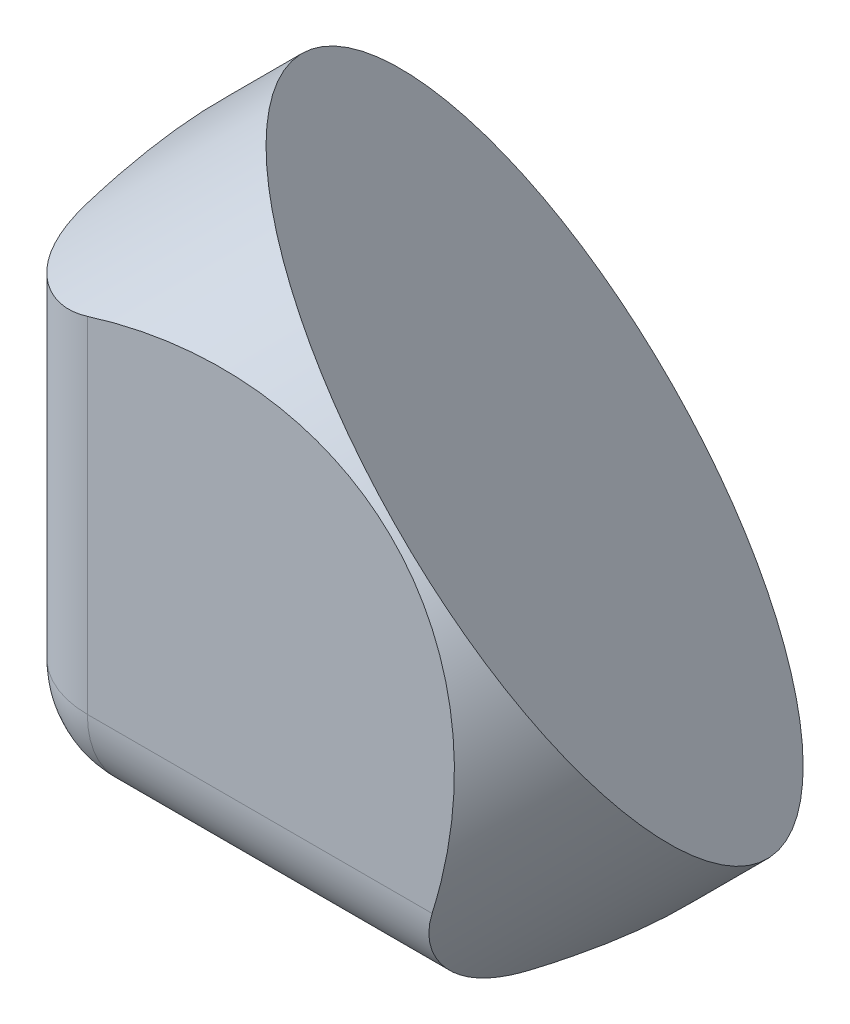
ISO-10303-21;
HEADER;
FILE_DESCRIPTION(('STEP AP214'),'2;1');
FILE_NAME('part.step','',(''),(''),'','','');
FILE_SCHEMA(('AUTOMOTIVE_DESIGN { 1 0 10303 214 1 1 1 1 }'));
ENDSEC;
DATA;
#1=APPLICATION_CONTEXT('core data for automotive mechanical design processes');
#2=APPLICATION_PROTOCOL_DEFINITION('international standard','automotive_design',2000,#1);
#3=PRODUCT_CONTEXT('',#1,'mechanical');
#4=PRODUCT('Part','Part','',(#3));
#5=PRODUCT_RELATED_PRODUCT_CATEGORY('part','',(#4));
#6=PRODUCT_DEFINITION_FORMATION('','',#4);
#7=PRODUCT_DEFINITION_CONTEXT('part definition',#1,'design');
#8=PRODUCT_DEFINITION('design','',#6,#7);
#9=PRODUCT_DEFINITION_SHAPE('','',#8);
#10=(LENGTH_UNIT() NAMED_UNIT(*) SI_UNIT(.MILLI.,.METRE.));
#11=(NAMED_UNIT(*) PLANE_ANGLE_UNIT() SI_UNIT($,.RADIAN.));
#12=(NAMED_UNIT(*) SI_UNIT($,.STERADIAN.) SOLID_ANGLE_UNIT());
#13=UNCERTAINTY_MEASURE_WITH_UNIT(LENGTH_MEASURE(1.E-05),#10,'distance_accuracy_value','');
#14=(GEOMETRIC_REPRESENTATION_CONTEXT(3) GLOBAL_UNCERTAINTY_ASSIGNED_CONTEXT((#13)) GLOBAL_UNIT_ASSIGNED_CONTEXT((#10,
#11,#12)) REPRESENTATION_CONTEXT('',''));
#15=CARTESIAN_POINT('',(0.,0.,0.));
#16=DIRECTION('',(0.,0.,1.));
#17=DIRECTION('',(1.,0.,0.));
#18=AXIS2_PLACEMENT_3D('',#15,#16,#17);
#19=CARTESIAN_POINT('',(-30.3006578729284,30.2993421270716,-90.8993421270716));
#20=DIRECTION('',(-0.577350269189626,-0.577350269189626,0.577350269189626));
#21=DIRECTION('',(0.,-0.707106781186547,-0.707106781186548));
#22=AXIS2_PLACEMENT_3D('',#19,#20,#21);
#23=PLANE('',#22);
#24=CARTESIAN_POINT('',(30.2993421270716,30.2993421270716,-30.2993421270716));
#25=DIRECTION('',(-0.577350269189626,-0.577350269189626,0.577350269189626));
#26=DIRECTION('',(0.,-0.707106781186547,-0.707106781186548));
#27=AXIS2_PLACEMENT_3D('',#24,#25,#26);
#28=CIRCLE('',#27,36.55);
#29=CARTESIAN_POINT('',(30.2993421270716,4.45458927470329,-56.1440949794399));
#30=VERTEX_POINT('',#29);
#31=EDGE_CURVE('E155',#30,#30,#28,.T.);
#32=ORIENTED_EDGE('',*,*,#31,.F.);
#33=EDGE_LOOP('',(#32));
#34=FACE_BOUND('',#33,.T.);
#35=ADVANCED_FACE('F31',(#34),#23,.F.);
#36=CARTESIAN_POINT('',(0.,0.,0.));
#37=DIRECTION('',(0.577350269189626,0.577350269189626,-0.577350269189626));
#38=DIRECTION('',(0.,0.707106781186547,0.707106781186548));
#39=AXIS2_PLACEMENT_3D('',#36,#37,#38);
#40=CYLINDRICAL_SURFACE('',#39,36.55);
#41=ORIENTED_EDGE('',*,*,#31,.T.);
#42=EDGE_LOOP('',(#41));
#43=FACE_BOUND('',#42,.T.);
#44=CARTESIAN_POINT('',(0.,0.,0.));
#45=DIRECTION('',(1.,0.,0.));
#46=DIRECTION('',(0.,0.707106781186548,-0.707106781186547));
#47=AXIS2_PLACEMENT_3D('',#44,#45,#46);
#48=ELLIPSE('',#47,63.3064570166425,36.55);
#49=CARTESIAN_POINT('',(0.,49.2078135879754,-10.9));
#50=VERTEX_POINT('',#49);
#51=CARTESIAN_POINT('',(0.,10.9,-49.2078135879754));
#52=VERTEX_POINT('',#51);
#53=EDGE_CURVE('E84',#50,#52,#48,.F.);
#54=ORIENTED_EDGE('',*,*,#53,.F.);
#55=CARTESIAN_POINT('',(0.,49.2078135879754,-10.9));
#56=CARTESIAN_POINT('',(-4.61873157645244E-05,49.1194894647511,-10.6180477587813));
#57=CARTESIAN_POINT('',(0.0109389786550706,49.036096616174,-10.3345271473238));
#58=CARTESIAN_POINT('',(0.0553652556785232,48.8790730828,-9.76651190275822));
#59=CARTESIAN_POINT('',(0.0888089294311351,48.8054435132216,-9.48201716218032));
#60=CARTESIAN_POINT('',(0.178531365130914,48.6678881711862,-8.91437211155707));
#61=CARTESIAN_POINT('',(0.23480285374926,48.603959316823,-8.63122140232508));
#62=CARTESIAN_POINT('',(0.370229771018021,48.485584608048,-8.06844939596022));
#63=CARTESIAN_POINT('',(0.449383668240398,48.4311381194099,-7.78882786394026));
#64=CARTESIAN_POINT('',(0.630507996742374,48.331414187978,-7.23495558413828));
#65=CARTESIAN_POINT('',(0.732509767127329,48.2861495034046,-6.9607127813731));
#66=CARTESIAN_POINT('',(0.95880911729093,48.2046200011177,-6.42020509574196));
#67=CARTESIAN_POINT('',(1.08310649310099,48.1683551010781,-6.15394013991765));
#68=CARTESIAN_POINT('',(1.35325209952,48.1045797689122,-5.63160074061387));
#69=CARTESIAN_POINT('',(1.49909292967832,48.0770663407375,-5.37552283594347));
#70=CARTESIAN_POINT('',(1.81143103659934,48.03055482483,-4.87548257584711));
#71=CARTESIAN_POINT('',(1.97792786607725,48.0115565527511,-4.63151995823697));
#72=CARTESIAN_POINT('',(2.32772044283021,47.9821351365796,-4.16126359732676));
#73=CARTESIAN_POINT('',(2.51071671022064,47.9715839712997,-3.93475501514815));
#74=CARTESIAN_POINT('',(2.89437554112294,47.9584750270612,-3.49698134887046));
#75=CARTESIAN_POINT('',(3.09503800096307,47.955917201198,-3.28571617533065));
#76=CARTESIAN_POINT('',(3.51260114775563,47.95877093765,-2.87995711180903));
#77=CARTESIAN_POINT('',(3.7295016806283,47.9641824243551,-2.68546306272713));
#78=CARTESIAN_POINT('',(4.17796260063587,47.9830249413339,-2.31461279150172));
#79=CARTESIAN_POINT('',(4.40952289797403,47.9964559224892,-2.13825645827504));
#80=CARTESIAN_POINT('',(4.88464211339817,48.0313886348958,-1.80553754627518));
#81=CARTESIAN_POINT('',(5.12814999600461,48.0528582605658,-1.64909870609883));
#82=CARTESIAN_POINT('',(5.62618141394479,48.1040521045328,-1.35640195503222));
#83=CARTESIAN_POINT('',(5.88070508204477,48.1337764223417,-1.22014428746035));
#84=CARTESIAN_POINT('',(6.39887434766964,48.201707775915,-0.968593841665019));
#85=CARTESIAN_POINT('',(6.66252160338999,48.2399163605873,-0.853304898542153));
#86=CARTESIAN_POINT('',(7.19686737169037,48.325059732481,-0.644313552707718));
#87=CARTESIAN_POINT('',(7.46756581811376,48.3719944378563,-0.550610947547051));
#88=CARTESIAN_POINT('',(7.99993766207183,48.4722035842084,-0.389386653932065));
#89=CARTESIAN_POINT('',(8.26136496733696,48.5250312563963,-0.320771422272349));
#90=CARTESIAN_POINT('',(8.78686807864334,48.6389509622047,-0.203404015208746));
#91=CARTESIAN_POINT('',(9.0509439126862,48.7000430832867,-0.154652050036844));
#92=CARTESIAN_POINT('',(9.57989050197905,48.8306335963181,-0.0769361052641851));
#93=CARTESIAN_POINT('',(9.84476117904615,48.9001311863109,-0.0479702396432165));
#94=CARTESIAN_POINT('',(10.3735399467846,49.047600003825,-0.00948555206082014));
#95=CARTESIAN_POINT('',(10.6374480951359,49.125570714672,3.44549706496652E-05));
#96=CARTESIAN_POINT('',(10.9,49.2078135879754,0.));
#97=B_SPLINE_CURVE_WITH_KNOTS('',3,(#55,#56,#57,#58,#59,#60,#61,#62,#63,#64,#65,#66,#67,#68,#69,
#70,#71,#72,#73,#74,#75,#76,#77,#78,#79,#80,#81,#82,#83,#84,#85,#86,#87,#88,#89,#90,#91,#92,#93,
#94,#95,#96),.UNSPECIFIED.,.F.,.F.,(4,2,2,2,2,2,2,2,2,2,2,2,2,2,2,2,2,2,2,2,4),(0.,
0.886171937761638,1.77244501219812,2.65843592651423,3.54436755872597,4.43152189534021,
5.31866811634689,6.20551029697605,7.09233327728432,7.96544702727003,8.83855565384312,
9.71165599671648,10.5847509920292,11.4543954937459,12.3240504796539,13.1938643625818,
14.0636700875625,14.8890090652406,15.714356778045,16.5396258073392,17.3648445415651),.UNSPECIFIED.);
#98=CARTESIAN_POINT('',(10.9,49.2078135879754,0.));
#99=VERTEX_POINT('',#98);
#100=EDGE_CURVE('E91',#50,#99,#97,.T.);
#101=ORIENTED_EDGE('',*,*,#100,.T.);
#102=CARTESIAN_POINT('',(0.,0.,0.));
#103=DIRECTION('',(0.,0.,-1.));
#104=DIRECTION('',(0.707106781186547,0.707106781186548,0.));
#105=AXIS2_PLACEMENT_3D('',#102,#103,#104);
#106=ELLIPSE('',#105,63.3064570166425,36.55);
#107=CARTESIAN_POINT('',(49.2078135879754,10.9,0.));
#108=VERTEX_POINT('',#107);
#109=EDGE_CURVE('E78',#108,#99,#106,.F.);
#110=ORIENTED_EDGE('',*,*,#109,.F.);
#111=CARTESIAN_POINT('',(49.2078135879754,10.9,0.));
#112=CARTESIAN_POINT('',(49.119489464751,10.6180477587813,4.61873157630694E-05));
#113=CARTESIAN_POINT('',(49.036096616174,10.3345271473238,-0.0109389786550718));
#114=CARTESIAN_POINT('',(48.8790730828,9.76651190275822,-0.0553652556785244));
#115=CARTESIAN_POINT('',(48.8054435132216,9.48201716218032,-0.0888089294311366));
#116=CARTESIAN_POINT('',(48.6678881711862,8.91437211155708,-0.178531365130915));
#117=CARTESIAN_POINT('',(48.603959316823,8.63122140232508,-0.234802853749261));
#118=CARTESIAN_POINT('',(48.4855846080479,8.06844939596022,-0.370229771018022));
#119=CARTESIAN_POINT('',(48.4311381194099,7.78882786394026,-0.4493836682404));
#120=CARTESIAN_POINT('',(48.331414187978,7.23495558413828,-0.630507996742375));
#121=CARTESIAN_POINT('',(48.2861495034045,6.96071278137311,-0.732509767127329));
#122=CARTESIAN_POINT('',(48.2046200011177,6.42020509574196,-0.958809117290928));
#123=CARTESIAN_POINT('',(48.1683551010781,6.15394013991766,-1.08310649310099));
#124=CARTESIAN_POINT('',(48.1045797689121,5.63160074061387,-1.35325209952));
#125=CARTESIAN_POINT('',(48.0770663407374,5.37552283594348,-1.49909292967832));
#126=CARTESIAN_POINT('',(48.0305548248299,4.87548257584712,-1.81143103659934));
#127=CARTESIAN_POINT('',(48.0115565527511,4.63151995823697,-1.97792786607725));
#128=CARTESIAN_POINT('',(47.9821351365795,4.16126359732676,-2.32772044283021));
#129=CARTESIAN_POINT('',(47.9715839712997,3.93475501514816,-2.51071671022064));
#130=CARTESIAN_POINT('',(47.9584750270612,3.49698134887046,-2.89437554112294));
#131=CARTESIAN_POINT('',(47.9559172011979,3.28571617533065,-3.09503800096307));
#132=CARTESIAN_POINT('',(47.9587709376499,2.87995711180903,-3.51260114775563));
#133=CARTESIAN_POINT('',(47.9641824243551,2.68546306272713,-3.7295016806283));
#134=CARTESIAN_POINT('',(47.9830249413339,2.31461279150172,-4.17796260063587));
#135=CARTESIAN_POINT('',(47.9964559224892,2.13825645827504,-4.40952289797403));
#136=CARTESIAN_POINT('',(48.0313886348957,1.80553754627518,-4.88464211339817));
#137=CARTESIAN_POINT('',(48.0528582605657,1.64909870609883,-5.12814999600462));
#138=CARTESIAN_POINT('',(48.1040521045328,1.35640195503222,-5.6261814139448));
#139=CARTESIAN_POINT('',(48.1337764223417,1.22014428746035,-5.88070508204477));
#140=CARTESIAN_POINT('',(48.2017077759149,0.96859384166502,-6.39887434766965));
#141=CARTESIAN_POINT('',(48.2399163605873,0.853304898542154,-6.66252160338999));
#142=CARTESIAN_POINT('',(48.325059732481,0.644313552707719,-7.19686737169036));
#143=CARTESIAN_POINT('',(48.3719944378563,0.550610947547052,-7.46756581811376));
#144=CARTESIAN_POINT('',(48.4722035842084,0.389386653932066,-7.99993766207183));
#145=CARTESIAN_POINT('',(48.5250312563963,0.320771422272349,-8.26136496733696));
#146=CARTESIAN_POINT('',(48.6389509622047,0.203404015208746,-8.78686807864334));
#147=CARTESIAN_POINT('',(48.7000430832866,0.154652050036844,-9.0509439126862));
#148=CARTESIAN_POINT('',(48.8306335963181,0.076936105264185,-9.57989050197906));
#149=CARTESIAN_POINT('',(48.9001311863109,0.0479702396432163,-9.84476117904615));
#150=CARTESIAN_POINT('',(49.047600003825,0.00948555206081953,-10.3735399467846));
#151=CARTESIAN_POINT('',(49.125570714672,-3.44549706506368E-05,-10.6374480951359));
#152=CARTESIAN_POINT('',(49.2078135879753,0.,-10.9));
#153=B_SPLINE_CURVE_WITH_KNOTS('',3,(#111,#112,#113,#114,#115,#116,#117,#118,#119,#120,#121,
#122,#123,#124,#125,#126,#127,#128,#129,#130,#131,#132,#133,#134,#135,#136,#137,#138,#139,#140,
#141,#142,#143,#144,#145,#146,#147,#148,#149,#150,#151,#152),.UNSPECIFIED.,.F.,.F.,(4,2,2,2,2,2,
2,2,2,2,2,2,2,2,2,2,2,2,2,2,4),(0.,0.886171937761638,1.77244501219813,2.65843592651424,
3.54436755872597,4.43152189534021,5.31866811634689,6.20551029697605,7.09233327728432,
7.96544702727003,8.83855565384312,9.71165599671648,10.5847509920293,11.4543954937459,
12.3240504796539,13.1938643625818,14.0636700875625,14.8890090652406,15.714356778045,
16.5396258073392,17.3648445415651),.UNSPECIFIED.);
#154=CARTESIAN_POINT('',(49.2078135879753,0.,-10.9));
#155=VERTEX_POINT('',#154);
#156=EDGE_CURVE('E89',#108,#155,#153,.T.);
#157=ORIENTED_EDGE('',*,*,#156,.T.);
#158=CARTESIAN_POINT('',(0.,0.,0.));
#159=DIRECTION('',(0.,-1.,0.));
#160=DIRECTION('',(0.707106781186548,0.,-0.707106781186548));
#161=AXIS2_PLACEMENT_3D('',#158,#159,#160);
#162=ELLIPSE('',#161,63.3064570166425,36.55);
#163=CARTESIAN_POINT('',(10.9,0.,-49.2078135879754));
#164=VERTEX_POINT('',#163);
#165=EDGE_CURVE('E92',#155,#164,#162,.F.);
#166=ORIENTED_EDGE('',*,*,#165,.T.);
#167=CARTESIAN_POINT('',(10.9,0.,-49.2078135879754));
#168=CARTESIAN_POINT('',(10.6180477587813,-4.6187315762635E-05,-49.119489464751));
#169=CARTESIAN_POINT('',(10.3345271473238,0.0109389786550728,-49.036096616174));
#170=CARTESIAN_POINT('',(9.7665119027582,0.0553652556785259,-48.8790730828));
#171=CARTESIAN_POINT('',(9.4820171621803,0.088808929431138,-48.8054435132216));
#172=CARTESIAN_POINT('',(8.91437211155706,0.178531365130915,-48.6678881711862));
#173=CARTESIAN_POINT('',(8.63122140232507,0.23480285374926,-48.603959316823));
#174=CARTESIAN_POINT('',(8.0684493959602,0.370229771018021,-48.485584608048));
#175=CARTESIAN_POINT('',(7.78882786394025,0.4493836682404,-48.4311381194099));
#176=CARTESIAN_POINT('',(7.23495558413827,0.630507996742378,-48.331414187978));
#177=CARTESIAN_POINT('',(6.96071278137309,0.732509767127332,-48.2861495034046));
#178=CARTESIAN_POINT('',(6.42020509574194,0.958809117290934,-48.2046200011177));
#179=CARTESIAN_POINT('',(6.15394013991764,1.083106493101,-48.1683551010781));
#180=CARTESIAN_POINT('',(5.63160074061385,1.35325209952,-48.1045797689121));
#181=CARTESIAN_POINT('',(5.37552283594346,1.49909292967832,-48.0770663407374));
#182=CARTESIAN_POINT('',(4.8754825758471,1.81143103659935,-48.0305548248299));
#183=CARTESIAN_POINT('',(4.63151995823695,1.97792786607726,-48.0115565527511));
#184=CARTESIAN_POINT('',(4.16126359732674,2.32772044283022,-47.9821351365795));
#185=CARTESIAN_POINT('',(3.93475501514814,2.51071671022065,-47.9715839712997));
#186=CARTESIAN_POINT('',(3.49698134887044,2.89437554112295,-47.9584750270612));
#187=CARTESIAN_POINT('',(3.28571617533063,3.09503800096307,-47.955917201198));
#188=CARTESIAN_POINT('',(2.87995711180902,3.51260114775564,-47.95877093765));
#189=CARTESIAN_POINT('',(2.68546306272711,3.72950168062831,-47.9641824243551));
#190=CARTESIAN_POINT('',(2.3146127915017,4.17796260063588,-47.9830249413339));
#191=CARTESIAN_POINT('',(2.13825645827502,4.40952289797404,-47.9964559224892));
#192=CARTESIAN_POINT('',(1.80553754627516,4.88464211339817,-48.0313886348957));
#193=CARTESIAN_POINT('',(1.64909870609882,5.12814999600462,-48.0528582605658));
#194=CARTESIAN_POINT('',(1.35640195503221,5.6261814139448,-48.1040521045328));
#195=CARTESIAN_POINT('',(1.22014428746033,5.88070508204478,-48.1337764223417));
#196=CARTESIAN_POINT('',(0.968593841665005,6.39887434766965,-48.2017077759149));
#197=CARTESIAN_POINT('',(0.85330489854214,6.66252160339,-48.2399163605873));
#198=CARTESIAN_POINT('',(0.644313552707706,7.19686737169037,-48.325059732481));
#199=CARTESIAN_POINT('',(0.55061094754704,7.46756581811377,-48.3719944378563));
#200=CARTESIAN_POINT('',(0.389386653932053,7.99993766207184,-48.4722035842084));
#201=CARTESIAN_POINT('',(0.320771422272335,8.26136496733697,-48.5250312563963));
#202=CARTESIAN_POINT('',(0.203404015208734,8.78686807864335,-48.6389509622047));
#203=CARTESIAN_POINT('',(0.154652050036834,9.05094391268621,-48.7000430832867));
#204=CARTESIAN_POINT('',(0.0769361052641761,9.57989050197906,-48.8306335963181));
#205=CARTESIAN_POINT('',(0.0479702396432065,9.84476117904615,-48.9001311863109));
#206=CARTESIAN_POINT('',(0.00948555206080837,10.3735399467846,-49.047600003825));
#207=CARTESIAN_POINT('',(-3.44549706621135E-05,10.6374480951359,-49.125570714672));
#208=CARTESIAN_POINT('',(0.,10.9,-49.2078135879754));
#209=B_SPLINE_CURVE_WITH_KNOTS('',3,(#167,#168,#169,#170,#171,#172,#173,#174,#175,#176,#177,
#178,#179,#180,#181,#182,#183,#184,#185,#186,#187,#188,#189,#190,#191,#192,#193,#194,#195,#196,
#197,#198,#199,#200,#201,#202,#203,#204,#205,#206,#207,#208),.UNSPECIFIED.,.F.,.F.,(4,2,2,2,2,2,
2,2,2,2,2,2,2,2,2,2,2,2,2,2,4),(0.,0.88617193776164,1.77244501219812,2.65843592651424,
3.54436755872597,4.43152189534021,5.3186681163469,6.20551029697605,7.09233327728433,
7.96544702727004,8.83855565384312,9.71165599671649,10.5847509920293,11.4543954937459,
12.3240504796539,13.1938643625818,14.0636700875625,14.8890090652406,15.714356778045,
16.5396258073392,17.3648445415651),.UNSPECIFIED.);
#210=EDGE_CURVE('E94',#164,#52,#209,.T.);
#211=ORIENTED_EDGE('',*,*,#210,.T.);
#212=EDGE_LOOP('',(#54,#101,#110,#157,#166,#211));
#213=FACE_BOUND('',#212,.T.);
#214=ADVANCED_FACE('F88',(#43,#213),#40,.T.);
#215=CARTESIAN_POINT('',(0.,60.6,0.));
#216=DIRECTION('',(1.,0.,0.));
#217=DIRECTION('',(0.,0.,-1.));
#218=AXIS2_PLACEMENT_3D('',#215,#216,#217);
#219=PLANE('',#218);
#220=DIRECTION('',(0.,0.,1.));
#221=VECTOR('',#220,1.);
#222=CARTESIAN_POINT('',(0.,10.9,0.));
#223=LINE('',#222,#221);
#224=CARTESIAN_POINT('',(0.,10.9,-10.9));
#225=VERTEX_POINT('',#224);
#226=EDGE_CURVE('E147',#52,#225,#223,.T.);
#227=ORIENTED_EDGE('',*,*,#226,.T.);
#228=DIRECTION('',(0.,-1.,0.));
#229=VECTOR('',#228,1.);
#230=CARTESIAN_POINT('',(0.,60.6,-10.9));
#231=LINE('',#230,#229);
#232=EDGE_CURVE('E97',#225,#50,#231,.F.);
#233=ORIENTED_EDGE('',*,*,#232,.T.);
#234=ORIENTED_EDGE('',*,*,#53,.T.);
#235=EDGE_LOOP('',(#227,#233,#234));
#236=FACE_BOUND('',#235,.T.);
#237=ADVANCED_FACE('F115',(#236),#219,.F.);
#238=CARTESIAN_POINT('',(0.,60.6,0.));
#239=DIRECTION('',(0.,0.,-1.));
#240=DIRECTION('',(-1.,0.,0.));
#241=AXIS2_PLACEMENT_3D('',#238,#239,#240);
#242=PLANE('',#241);
#243=ORIENTED_EDGE('',*,*,#109,.T.);
#244=DIRECTION('',(0.,-1.,0.));
#245=VECTOR('',#244,1.);
#246=CARTESIAN_POINT('',(10.9,60.6,0.));
#247=LINE('',#246,#245);
#248=CARTESIAN_POINT('',(10.9,10.9,0.));
#249=VERTEX_POINT('',#248);
#250=EDGE_CURVE('E80',#99,#249,#247,.T.);
#251=ORIENTED_EDGE('',*,*,#250,.T.);
#252=DIRECTION('',(1.,0.,0.));
#253=VECTOR('',#252,1.);
#254=CARTESIAN_POINT('',(44.7644250493626,10.9,0.));
#255=LINE('',#254,#253);
#256=EDGE_CURVE('E75',#249,#108,#255,.T.);
#257=ORIENTED_EDGE('',*,*,#256,.T.);
#258=EDGE_LOOP('',(#243,#251,#257));
#259=FACE_BOUND('',#258,.T.);
#260=ADVANCED_FACE('F77',(#259),#242,.F.);
#261=CARTESIAN_POINT('',(0.,0.,-60.6));
#262=DIRECTION('',(0.,-1.,0.));
#263=DIRECTION('',(0.,0.,-1.));
#264=AXIS2_PLACEMENT_3D('',#261,#262,#263);
#265=PLANE('',#264);
#266=ORIENTED_EDGE('',*,*,#165,.F.);
#267=DIRECTION('',(1.,0.,0.));
#268=VECTOR('',#267,1.);
#269=CARTESIAN_POINT('',(0.,0.,-10.9));
#270=LINE('',#269,#268);
#271=CARTESIAN_POINT('',(10.9,0.,-10.9));
#272=VERTEX_POINT('',#271);
#273=EDGE_CURVE('E11',#155,#272,#270,.F.);
#274=ORIENTED_EDGE('',*,*,#273,.T.);
#275=DIRECTION('',(0.,0.,1.));
#276=VECTOR('',#275,1.);
#277=CARTESIAN_POINT('',(10.9,0.,-44.7644250493626));
#278=LINE('',#277,#276);
#279=EDGE_CURVE('E41',#272,#164,#278,.F.);
#280=ORIENTED_EDGE('',*,*,#279,.T.);
#281=EDGE_LOOP('',(#266,#274,#280));
#282=FACE_BOUND('',#281,.T.);
#283=ADVANCED_FACE('F122',(#282),#265,.T.);
#284=CARTESIAN_POINT('',(0.,10.9,-10.9));
#285=DIRECTION('',(-1.,0.,0.));
#286=DIRECTION('',(0.,0.,1.));
#287=AXIS2_PLACEMENT_3D('',#284,#285,#286);
#288=CYLINDRICAL_SURFACE('',#287,10.9);
#289=ORIENTED_EDGE('',*,*,#156,.F.);
#290=ORIENTED_EDGE('',*,*,#256,.F.);
#291=CARTESIAN_POINT('',(10.9,10.9,-10.9));
#292=DIRECTION('',(-1.,0.,0.));
#293=DIRECTION('',(0.,0.,1.));
#294=AXIS2_PLACEMENT_3D('',#291,#292,#293);
#295=CIRCLE('',#294,10.9);
#296=EDGE_CURVE('E36',#272,#249,#295,.T.);
#297=ORIENTED_EDGE('',*,*,#296,.F.);
#298=ORIENTED_EDGE('',*,*,#273,.F.);
#299=EDGE_LOOP('',(#289,#290,#297,#298));
#300=FACE_BOUND('',#299,.T.);
#301=ADVANCED_FACE('F33',(#300),#288,.T.);
#302=CARTESIAN_POINT('',(10.9,10.9,0.));
#303=DIRECTION('',(0.,0.,-1.));
#304=DIRECTION('',(-1.,0.,0.));
#305=AXIS2_PLACEMENT_3D('',#302,#303,#304);
#306=CYLINDRICAL_SURFACE('',#305,10.9);
#307=ORIENTED_EDGE('',*,*,#210,.F.);
#308=ORIENTED_EDGE('',*,*,#279,.F.);
#309=CARTESIAN_POINT('',(10.9,10.9,-10.9));
#310=DIRECTION('',(0.,0.,1.));
#311=DIRECTION('',(1.,0.,0.));
#312=AXIS2_PLACEMENT_3D('',#309,#310,#311);
#313=CIRCLE('',#312,10.9);
#314=EDGE_CURVE('E159',#225,#272,#313,.T.);
#315=ORIENTED_EDGE('',*,*,#314,.F.);
#316=ORIENTED_EDGE('',*,*,#226,.F.);
#317=EDGE_LOOP('',(#307,#308,#315,#316));
#318=FACE_BOUND('',#317,.T.);
#319=ADVANCED_FACE('F136',(#318),#306,.T.);
#320=CARTESIAN_POINT('',(10.9,10.9,-10.9));
#321=DIRECTION('',(0.,0.,1.));
#322=DIRECTION('',(1.,0.,0.));
#323=AXIS2_PLACEMENT_3D('',#320,#321,#322);
#324=SPHERICAL_SURFACE('',#323,10.9);
#325=ORIENTED_EDGE('',*,*,#314,.T.);
#326=ORIENTED_EDGE('',*,*,#296,.T.);
#327=CARTESIAN_POINT('',(10.9,10.9,-10.9));
#328=DIRECTION('',(0.,-1.,0.));
#329=DIRECTION('',(0.,0.,-1.));
#330=AXIS2_PLACEMENT_3D('',#327,#328,#329);
#331=CIRCLE('',#330,10.9);
#332=EDGE_CURVE('E162',#225,#249,#331,.F.);
#333=ORIENTED_EDGE('',*,*,#332,.F.);
#334=EDGE_LOOP('',(#325,#326,#333));
#335=FACE_BOUND('',#334,.T.);
#336=ADVANCED_FACE('F133',(#335),#324,.T.);
#337=CARTESIAN_POINT('',(10.9,60.6,-10.9));
#338=DIRECTION('',(0.,-1.,0.));
#339=DIRECTION('',(0.,0.,-1.));
#340=AXIS2_PLACEMENT_3D('',#337,#338,#339);
#341=CYLINDRICAL_SURFACE('',#340,10.9);
#342=ORIENTED_EDGE('',*,*,#100,.F.);
#343=ORIENTED_EDGE('',*,*,#232,.F.);
#344=ORIENTED_EDGE('',*,*,#332,.T.);
#345=ORIENTED_EDGE('',*,*,#250,.F.);
#346=EDGE_LOOP('',(#342,#343,#344,#345));
#347=FACE_BOUND('',#346,.T.);
#348=ADVANCED_FACE('F129',(#347),#341,.T.);
#349=CLOSED_SHELL('',(#35,#214,#237,#260,#283,#301,#319,#336,#348));
#350=MANIFOLD_SOLID_BREP('B2',#349);
#351=ADVANCED_BREP_SHAPE_REPRESENTATION('',(#18,#350),#14);
#352=SHAPE_DEFINITION_REPRESENTATION(#9,#351);
ENDSEC;
END-ISO-10303-21;
